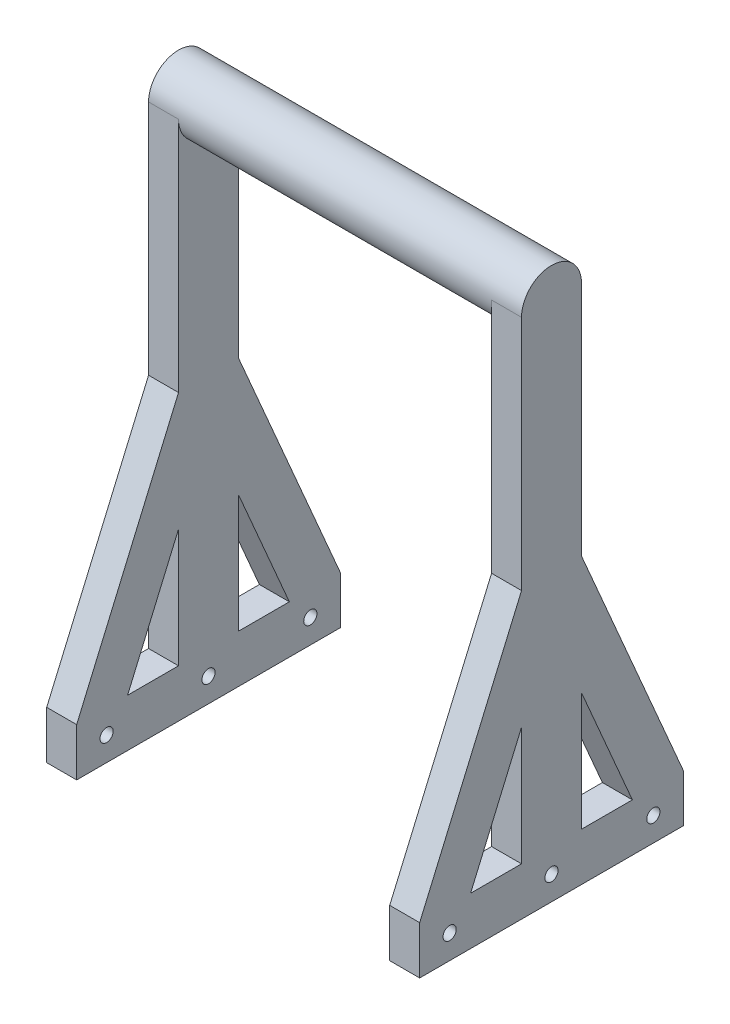
ISO-10303-21;
HEADER;
FILE_DESCRIPTION(('STEP AP214'),'2;1');
FILE_NAME('part.step','',(''),(''),'','','');
FILE_SCHEMA(('AUTOMOTIVE_DESIGN { 1 0 10303 214 1 1 1 1 }'));
ENDSEC;
DATA;
#1=APPLICATION_CONTEXT('core data for automotive mechanical design processes');
#2=APPLICATION_PROTOCOL_DEFINITION('international standard','automotive_design',2000,#1);
#3=PRODUCT_CONTEXT('',#1,'mechanical');
#4=PRODUCT('Part','Part','',(#3));
#5=PRODUCT_RELATED_PRODUCT_CATEGORY('part','',(#4));
#6=PRODUCT_DEFINITION_FORMATION('','',#4);
#7=PRODUCT_DEFINITION_CONTEXT('part definition',#1,'design');
#8=PRODUCT_DEFINITION('design','',#6,#7);
#9=PRODUCT_DEFINITION_SHAPE('','',#8);
#10=(LENGTH_UNIT() NAMED_UNIT(*) SI_UNIT(.MILLI.,.METRE.));
#11=(NAMED_UNIT(*) PLANE_ANGLE_UNIT() SI_UNIT($,.RADIAN.));
#12=(NAMED_UNIT(*) SI_UNIT($,.STERADIAN.) SOLID_ANGLE_UNIT());
#13=UNCERTAINTY_MEASURE_WITH_UNIT(LENGTH_MEASURE(1.E-05),#10,'distance_accuracy_value','');
#14=(GEOMETRIC_REPRESENTATION_CONTEXT(3) GLOBAL_UNCERTAINTY_ASSIGNED_CONTEXT((#13)) GLOBAL_UNIT_ASSIGNED_CONTEXT((#10,
#11,#12)) REPRESENTATION_CONTEXT('',''));
#15=CARTESIAN_POINT('',(0.,0.,0.));
#16=DIRECTION('',(0.,0.,1.));
#17=DIRECTION('',(1.,0.,0.));
#18=AXIS2_PLACEMENT_3D('',#15,#16,#17);
#19=CARTESIAN_POINT('',(62.25,174.,-10.));
#20=DIRECTION('',(0.,0.,1.));
#21=DIRECTION('',(1.,0.,0.));
#22=AXIS2_PLACEMENT_3D('',#19,#20,#21);
#23=PLANE('',#22);
#24=DIRECTION('',(0.,-1.,0.));
#25=VECTOR('',#24,1.);
#26=CARTESIAN_POINT('',(52.25,174.,-10.));
#27=LINE('',#26,#25);
#28=CARTESIAN_POINT('',(52.25,55.4999999999999,-10.));
#29=VERTEX_POINT('',#28);
#30=CARTESIAN_POINT('',(52.25,16.,-10.));
#31=VERTEX_POINT('',#30);
#32=EDGE_CURVE('E251',#29,#31,#27,.T.);
#33=ORIENTED_EDGE('',*,*,#32,.F.);
#34=DIRECTION('',(1.,0.,0.));
#35=VECTOR('',#34,1.);
#36=CARTESIAN_POINT('',(52.25,55.4999999999999,-10.0000000000001));
#37=LINE('',#36,#35);
#38=CARTESIAN_POINT('',(62.25,55.4999999999999,-10.0000000000001));
#39=VERTEX_POINT('',#38);
#40=EDGE_CURVE('E406',#29,#39,#37,.T.);
#41=ORIENTED_EDGE('',*,*,#40,.T.);
#42=DIRECTION('',(0.,-1.,0.));
#43=VECTOR('',#42,1.);
#44=CARTESIAN_POINT('',(62.25,174.,-10.));
#45=LINE('',#44,#43);
#46=CARTESIAN_POINT('',(62.25,16.,-10.));
#47=VERTEX_POINT('',#46);
#48=EDGE_CURVE('E396',#39,#47,#45,.T.);
#49=ORIENTED_EDGE('',*,*,#48,.T.);
#50=DIRECTION('',(-1.,0.,0.));
#51=VECTOR('',#50,1.);
#52=CARTESIAN_POINT('',(62.25,16.,-10.));
#53=LINE('',#52,#51);
#54=EDGE_CURVE('E261',#47,#31,#53,.T.);
#55=ORIENTED_EDGE('',*,*,#54,.T.);
#56=EDGE_LOOP('',(#33,#41,#49,#55));
#57=FACE_BOUND('',#56,.T.);
#58=ADVANCED_FACE('F39',(#57),#23,.F.);
#59=CARTESIAN_POINT('',(62.25,174.,9.99999999999999));
#60=DIRECTION('',(0.,0.,-1.));
#61=DIRECTION('',(-1.,0.,0.));
#62=AXIS2_PLACEMENT_3D('',#59,#60,#61);
#63=PLANE('',#62);
#64=DIRECTION('',(0.,-1.,0.));
#65=VECTOR('',#64,1.);
#66=CARTESIAN_POINT('',(52.25,174.,9.99999999999999));
#67=LINE('',#66,#65);
#68=CARTESIAN_POINT('',(52.25,174.,9.99999999999999));
#69=VERTEX_POINT('',#68);
#70=CARTESIAN_POINT('',(52.25,95.,9.99999999999999));
#71=VERTEX_POINT('',#70);
#72=EDGE_CURVE('E246',#69,#71,#67,.T.);
#73=ORIENTED_EDGE('',*,*,#72,.T.);
#74=DIRECTION('',(1.,0.,0.));
#75=VECTOR('',#74,1.);
#76=CARTESIAN_POINT('',(52.25,95.,9.99999999999999));
#77=LINE('',#76,#75);
#78=CARTESIAN_POINT('',(62.25,95.,9.99999999999999));
#79=VERTEX_POINT('',#78);
#80=EDGE_CURVE('E242',#71,#79,#77,.T.);
#81=ORIENTED_EDGE('',*,*,#80,.T.);
#82=DIRECTION('',(0.,-1.,0.));
#83=VECTOR('',#82,1.);
#84=CARTESIAN_POINT('',(62.25,174.,9.99999999999999));
#85=LINE('',#84,#83);
#86=CARTESIAN_POINT('',(62.25,174.,9.99999999999999));
#87=VERTEX_POINT('',#86);
#88=EDGE_CURVE('E255',#87,#79,#85,.T.);
#89=ORIENTED_EDGE('',*,*,#88,.F.);
#90=DIRECTION('',(1.,0.,0.));
#91=VECTOR('',#90,1.);
#92=CARTESIAN_POINT('',(62.25,174.,9.99999999999999));
#93=LINE('',#92,#91);
#94=EDGE_CURVE('E258',#69,#87,#93,.T.);
#95=ORIENTED_EDGE('',*,*,#94,.F.);
#96=EDGE_LOOP('',(#73,#81,#89,#95));
#97=FACE_BOUND('',#96,.T.);
#98=ADVANCED_FACE('F509',(#97),#63,.F.);
#99=CARTESIAN_POINT('',(-62.25,174.,10.));
#100=DIRECTION('',(0.,0.,-1.));
#101=DIRECTION('',(-1.,0.,0.));
#102=AXIS2_PLACEMENT_3D('',#99,#100,#101);
#103=PLANE('',#102);
#104=DIRECTION('',(0.,-1.,0.));
#105=VECTOR('',#104,1.);
#106=CARTESIAN_POINT('',(-52.25,174.,10.));
#107=LINE('',#106,#105);
#108=CARTESIAN_POINT('',(-52.25,55.5,10.));
#109=VERTEX_POINT('',#108);
#110=CARTESIAN_POINT('',(-52.25,16.,10.));
#111=VERTEX_POINT('',#110);
#112=EDGE_CURVE('E329',#109,#111,#107,.T.);
#113=ORIENTED_EDGE('',*,*,#112,.F.);
#114=DIRECTION('',(-1.,0.,0.));
#115=VECTOR('',#114,1.);
#116=CARTESIAN_POINT('',(-52.25,55.5,9.99999999999997));
#117=LINE('',#116,#115);
#118=CARTESIAN_POINT('',(-62.25,55.5,9.99999999999997));
#119=VERTEX_POINT('',#118);
#120=EDGE_CURVE('E459',#109,#119,#117,.T.);
#121=ORIENTED_EDGE('',*,*,#120,.T.);
#122=DIRECTION('',(0.,-1.,0.));
#123=VECTOR('',#122,1.);
#124=CARTESIAN_POINT('',(-62.25,174.,10.));
#125=LINE('',#124,#123);
#126=CARTESIAN_POINT('',(-62.25,16.,10.));
#127=VERTEX_POINT('',#126);
#128=EDGE_CURVE('E333',#119,#127,#125,.T.);
#129=ORIENTED_EDGE('',*,*,#128,.T.);
#130=DIRECTION('',(1.,0.,0.));
#131=VECTOR('',#130,1.);
#132=CARTESIAN_POINT('',(-62.25,16.,10.));
#133=LINE('',#132,#131);
#134=EDGE_CURVE('E309',#127,#111,#133,.T.);
#135=ORIENTED_EDGE('',*,*,#134,.T.);
#136=EDGE_LOOP('',(#113,#121,#129,#135));
#137=FACE_BOUND('',#136,.T.);
#138=ADVANCED_FACE('F506',(#137),#103,.F.);
#139=CARTESIAN_POINT('',(-62.25,174.,-10.));
#140=DIRECTION('',(0.,0.,1.));
#141=DIRECTION('',(1.,0.,0.));
#142=AXIS2_PLACEMENT_3D('',#139,#140,#141);
#143=PLANE('',#142);
#144=DIRECTION('',(0.,-1.,0.));
#145=VECTOR('',#144,1.);
#146=CARTESIAN_POINT('',(-52.25,174.,-10.));
#147=LINE('',#146,#145);
#148=CARTESIAN_POINT('',(-52.25,174.,-10.));
#149=VERTEX_POINT('',#148);
#150=CARTESIAN_POINT('',(-52.25,95.,-9.99999999999999));
#151=VERTEX_POINT('',#150);
#152=EDGE_CURVE('E326',#149,#151,#147,.T.);
#153=ORIENTED_EDGE('',*,*,#152,.T.);
#154=DIRECTION('',(-1.,0.,0.));
#155=VECTOR('',#154,1.);
#156=CARTESIAN_POINT('',(-52.25,95.,-9.99999999999999));
#157=LINE('',#156,#155);
#158=CARTESIAN_POINT('',(-62.25,95.,-10.));
#159=VERTEX_POINT('',#158);
#160=EDGE_CURVE('E446',#151,#159,#157,.T.);
#161=ORIENTED_EDGE('',*,*,#160,.T.);
#162=DIRECTION('',(0.,-1.,0.));
#163=VECTOR('',#162,1.);
#164=CARTESIAN_POINT('',(-62.25,174.,-10.));
#165=LINE('',#164,#163);
#166=CARTESIAN_POINT('',(-62.25,174.,-10.));
#167=VERTEX_POINT('',#166);
#168=EDGE_CURVE('E322',#167,#159,#165,.T.);
#169=ORIENTED_EDGE('',*,*,#168,.F.);
#170=DIRECTION('',(-1.,0.,0.));
#171=VECTOR('',#170,1.);
#172=CARTESIAN_POINT('',(-62.25,174.,-10.));
#173=LINE('',#172,#171);
#174=EDGE_CURVE('E313',#149,#167,#173,.T.);
#175=ORIENTED_EDGE('',*,*,#174,.F.);
#176=EDGE_LOOP('',(#153,#161,#169,#175));
#177=FACE_BOUND('',#176,.T.);
#178=ADVANCED_FACE('F508',(#177),#143,.F.);
#179=CARTESIAN_POINT('',(62.25,174.,0.));
#180=DIRECTION('',(-1.,0.,0.));
#181=DIRECTION('',(0.,0.,1.));
#182=AXIS2_PLACEMENT_3D('',#179,#180,#181);
#183=CYLINDRICAL_SURFACE('',#182,10.);
#184=CARTESIAN_POINT('',(-52.25,174.,0.));
#185=DIRECTION('',(-1.,0.,0.));
#186=DIRECTION('',(0.,0.,1.));
#187=AXIS2_PLACEMENT_3D('',#184,#185,#186);
#188=CIRCLE('',#187,10.);
#189=CARTESIAN_POINT('',(-52.25,174.,10.));
#190=VERTEX_POINT('',#189);
#191=EDGE_CURVE('E305',#149,#190,#188,.T.);
#192=ORIENTED_EDGE('',*,*,#191,.F.);
#193=ORIENTED_EDGE('',*,*,#174,.T.);
#194=CARTESIAN_POINT('',(-62.25,174.,0.));
#195=DIRECTION('',(-1.,0.,0.));
#196=DIRECTION('',(0.,0.,1.));
#197=AXIS2_PLACEMENT_3D('',#194,#195,#196);
#198=CIRCLE('',#197,10.);
#199=CARTESIAN_POINT('',(-62.25,174.,10.));
#200=VERTEX_POINT('',#199);
#201=EDGE_CURVE('E292',#200,#167,#198,.T.);
#202=ORIENTED_EDGE('',*,*,#201,.F.);
#203=DIRECTION('',(1.,0.,0.));
#204=VECTOR('',#203,1.);
#205=CARTESIAN_POINT('',(-62.25,174.,10.));
#206=LINE('',#205,#204);
#207=EDGE_CURVE('E310',#200,#190,#206,.T.);
#208=ORIENTED_EDGE('',*,*,#207,.T.);
#209=EDGE_LOOP('',(#192,#193,#202,#208));
#210=FACE_BOUND('',#209,.T.);
#211=CARTESIAN_POINT('',(52.25,174.,0.));
#212=DIRECTION('',(1.,0.,0.));
#213=DIRECTION('',(0.,0.,-1.));
#214=AXIS2_PLACEMENT_3D('',#211,#212,#213);
#215=CIRCLE('',#214,10.);
#216=CARTESIAN_POINT('',(52.25,174.,-10.));
#217=VERTEX_POINT('',#216);
#218=EDGE_CURVE('E11',#217,#69,#215,.F.);
#219=ORIENTED_EDGE('',*,*,#218,.T.);
#220=ORIENTED_EDGE('',*,*,#94,.T.);
#221=CARTESIAN_POINT('',(62.25,174.,0.));
#222=DIRECTION('',(-1.,0.,0.));
#223=DIRECTION('',(0.,0.,1.));
#224=AXIS2_PLACEMENT_3D('',#221,#222,#223);
#225=CIRCLE('',#224,10.);
#226=CARTESIAN_POINT('',(62.25,174.,-10.));
#227=VERTEX_POINT('',#226);
#228=EDGE_CURVE('E302',#87,#227,#225,.T.);
#229=ORIENTED_EDGE('',*,*,#228,.T.);
#230=DIRECTION('',(-1.,0.,0.));
#231=VECTOR('',#230,1.);
#232=CARTESIAN_POINT('',(62.25,174.,-10.));
#233=LINE('',#232,#231);
#234=EDGE_CURVE('E262',#227,#217,#233,.T.);
#235=ORIENTED_EDGE('',*,*,#234,.T.);
#236=EDGE_LOOP('',(#219,#220,#229,#235));
#237=FACE_BOUND('',#236,.T.);
#238=ADVANCED_FACE('F516',(#210,#237),#183,.T.);
#239=CARTESIAN_POINT('',(0.,16.,0.));
#240=DIRECTION('',(0.,1.,0.));
#241=DIRECTION('',(0.,0.,1.));
#242=AXIS2_PLACEMENT_3D('',#239,#240,#241);
#243=PLANE('',#242);
#244=DIRECTION('',(-1.,0.,0.));
#245=VECTOR('',#244,1.);
#246=CARTESIAN_POINT('',(-52.25,16.,-27.));
#247=LINE('',#246,#245);
#248=CARTESIAN_POINT('',(-52.25,16.,-27.));
#249=VERTEX_POINT('',#248);
#250=CARTESIAN_POINT('',(-62.25,16.,-27.));
#251=VERTEX_POINT('',#250);
#252=EDGE_CURVE('E440',#249,#251,#247,.T.);
#253=ORIENTED_EDGE('',*,*,#252,.T.);
#254=DIRECTION('',(0.,0.,1.));
#255=VECTOR('',#254,1.);
#256=CARTESIAN_POINT('',(-62.25,16.,-44.));
#257=LINE('',#256,#255);
#258=CARTESIAN_POINT('',(-62.25,16.,-10.));
#259=VERTEX_POINT('',#258);
#260=EDGE_CURVE('E344',#251,#259,#257,.T.);
#261=ORIENTED_EDGE('',*,*,#260,.T.);
#262=DIRECTION('',(-1.,0.,0.));
#263=VECTOR('',#262,1.);
#264=CARTESIAN_POINT('',(-62.25,16.,-10.));
#265=LINE('',#264,#263);
#266=CARTESIAN_POINT('',(-52.25,16.,-10.));
#267=VERTEX_POINT('',#266);
#268=EDGE_CURVE('E314',#267,#259,#265,.T.);
#269=ORIENTED_EDGE('',*,*,#268,.F.);
#270=DIRECTION('',(0.,0.,-1.));
#271=VECTOR('',#270,1.);
#272=CARTESIAN_POINT('',(-52.25,16.,-44.));
#273=LINE('',#272,#271);
#274=EDGE_CURVE('E340',#267,#249,#273,.T.);
#275=ORIENTED_EDGE('',*,*,#274,.T.);
#276=EDGE_LOOP('',(#253,#261,#269,#275));
#277=FACE_BOUND('',#276,.T.);
#278=ADVANCED_FACE('F558',(#277),#243,.T.);
#279=CARTESIAN_POINT('',(-52.25,16.,-44.));
#280=DIRECTION('',(-1.,0.,0.));
#281=DIRECTION('',(0.,0.,1.));
#282=AXIS2_PLACEMENT_3D('',#279,#280,#281);
#283=PLANE('',#282);
#284=DIRECTION('',(0.,0.918542556009364,0.395322112712891));
#285=VECTOR('',#284,1.);
#286=CARTESIAN_POINT('',(-52.25,16.,-27.));
#287=LINE('',#286,#285);
#288=CARTESIAN_POINT('',(-52.25,55.5,-9.99999999999998));
#289=VERTEX_POINT('',#288);
#290=EDGE_CURVE('E434',#249,#289,#287,.T.);
#291=ORIENTED_EDGE('',*,*,#290,.F.);
#292=ORIENTED_EDGE('',*,*,#274,.F.);
#293=EDGE_CURVE('E325',#289,#267,#147,.T.);
#294=ORIENTED_EDGE('',*,*,#293,.F.);
#295=EDGE_LOOP('',(#291,#292,#294));
#296=FACE_BOUND('',#295,.T.);
#297=CARTESIAN_POINT('',(-52.25,16.,27.));
#298=VERTEX_POINT('',#297);
#299=EDGE_CURVE('E337',#298,#111,#273,.T.);
#300=ORIENTED_EDGE('',*,*,#299,.F.);
#301=DIRECTION('',(0.,-0.918542556009364,0.395322112712891));
#302=VECTOR('',#301,1.);
#303=CARTESIAN_POINT('',(-52.25,16.,27.));
#304=LINE('',#303,#302);
#305=EDGE_CURVE('E458',#109,#298,#304,.T.);
#306=ORIENTED_EDGE('',*,*,#305,.F.);
#307=ORIENTED_EDGE('',*,*,#112,.T.);
#308=EDGE_LOOP('',(#300,#306,#307));
#309=FACE_BOUND('',#308,.T.);
#310=CARTESIAN_POINT('',(-52.25,8.00000000000001,34.));
#311=DIRECTION('',(-1.,0.,0.));
#312=DIRECTION('',(0.,0.,1.));
#313=AXIS2_PLACEMENT_3D('',#310,#311,#312);
#314=CIRCLE('',#313,2.2);
#315=CARTESIAN_POINT('',(-52.25,8.00000000000001,36.2));
#316=VERTEX_POINT('',#315);
#317=EDGE_CURVE('E394',#316,#316,#314,.T.);
#318=ORIENTED_EDGE('',*,*,#317,.T.);
#319=EDGE_LOOP('',(#318));
#320=FACE_BOUND('',#319,.T.);
#321=CARTESIAN_POINT('',(-52.25,8.00000000000001,-34.));
#322=DIRECTION('',(-1.,0.,0.));
#323=DIRECTION('',(0.,0.,1.));
#324=AXIS2_PLACEMENT_3D('',#321,#322,#323);
#325=CIRCLE('',#324,2.2);
#326=CARTESIAN_POINT('',(-52.25,8.00000000000001,-31.8));
#327=VERTEX_POINT('',#326);
#328=EDGE_CURVE('E379',#327,#327,#325,.T.);
#329=ORIENTED_EDGE('',*,*,#328,.T.);
#330=EDGE_LOOP('',(#329));
#331=FACE_BOUND('',#330,.T.);
#332=CARTESIAN_POINT('',(-52.25,8.,0.));
#333=DIRECTION('',(-1.,0.,0.));
#334=DIRECTION('',(0.,0.,1.));
#335=AXIS2_PLACEMENT_3D('',#332,#333,#334);
#336=CIRCLE('',#335,2.2);
#337=CARTESIAN_POINT('',(-52.25,8.,2.2));
#338=VERTEX_POINT('',#337);
#339=EDGE_CURVE('E375',#338,#338,#336,.T.);
#340=ORIENTED_EDGE('',*,*,#339,.T.);
#341=EDGE_LOOP('',(#340));
#342=FACE_BOUND('',#341,.T.);
#343=ORIENTED_EDGE('',*,*,#152,.F.);
#344=ORIENTED_EDGE('',*,*,#191,.T.);
#345=CARTESIAN_POINT('',(-52.25,95.,10.));
#346=VERTEX_POINT('',#345);
#347=EDGE_CURVE('E330',#190,#346,#107,.T.);
#348=ORIENTED_EDGE('',*,*,#347,.T.);
#349=DIRECTION('',(0.,0.918542556009365,-0.395322112712891));
#350=VECTOR('',#349,1.);
#351=CARTESIAN_POINT('',(-52.25,16.,44.));
#352=LINE('',#351,#350);
#353=CARTESIAN_POINT('',(-52.25,16.,44.));
#354=VERTEX_POINT('',#353);
#355=EDGE_CURVE('E468',#354,#346,#352,.T.);
#356=ORIENTED_EDGE('',*,*,#355,.F.);
#357=DIRECTION('',(0.,-1.,0.));
#358=VECTOR('',#357,1.);
#359=CARTESIAN_POINT('',(-52.25,16.,44.));
#360=LINE('',#359,#358);
#361=CARTESIAN_POINT('',(-52.25,0.,44.));
#362=VERTEX_POINT('',#361);
#363=EDGE_CURVE('E349',#354,#362,#360,.T.);
#364=ORIENTED_EDGE('',*,*,#363,.T.);
#365=DIRECTION('',(0.,0.,-1.));
#366=VECTOR('',#365,1.);
#367=CARTESIAN_POINT('',(-52.25,0.,-44.));
#368=LINE('',#367,#366);
#369=CARTESIAN_POINT('',(-52.25,0.,-44.));
#370=VERTEX_POINT('',#369);
#371=EDGE_CURVE('E336',#362,#370,#368,.T.);
#372=ORIENTED_EDGE('',*,*,#371,.T.);
#373=DIRECTION('',(0.,-1.,0.));
#374=VECTOR('',#373,1.);
#375=CARTESIAN_POINT('',(-52.25,16.,-44.));
#376=LINE('',#375,#374);
#377=CARTESIAN_POINT('',(-52.25,16.,-44.));
#378=VERTEX_POINT('',#377);
#379=EDGE_CURVE('E48',#378,#370,#376,.T.);
#380=ORIENTED_EDGE('',*,*,#379,.F.);
#381=DIRECTION('',(0.,-0.918542556009364,-0.395322112712891));
#382=VECTOR('',#381,1.);
#383=CARTESIAN_POINT('',(-52.25,16.,-44.));
#384=LINE('',#383,#382);
#385=EDGE_CURVE('E436',#151,#378,#384,.T.);
#386=ORIENTED_EDGE('',*,*,#385,.F.);
#387=EDGE_LOOP('',(#343,#344,#348,#356,#364,#372,#380,#386));
#388=FACE_BOUND('',#387,.T.);
#389=ADVANCED_FACE('F41',(#296,#309,#320,#331,#342,#388),#283,.F.);
#390=CARTESIAN_POINT('',(-62.25,16.,-44.));
#391=DIRECTION('',(0.,0.,1.));
#392=DIRECTION('',(1.,0.,0.));
#393=AXIS2_PLACEMENT_3D('',#390,#391,#392);
#394=PLANE('',#393);
#395=DIRECTION('',(-1.,0.,0.));
#396=VECTOR('',#395,1.);
#397=CARTESIAN_POINT('',(-62.25,0.,-44.));
#398=LINE('',#397,#396);
#399=CARTESIAN_POINT('',(-62.25,0.,-44.));
#400=VERTEX_POINT('',#399);
#401=EDGE_CURVE('E352',#370,#400,#398,.T.);
#402=ORIENTED_EDGE('',*,*,#401,.T.);
#403=DIRECTION('',(0.,-1.,0.));
#404=VECTOR('',#403,1.);
#405=CARTESIAN_POINT('',(-62.25,16.,-44.));
#406=LINE('',#405,#404);
#407=CARTESIAN_POINT('',(-62.25,16.,-44.));
#408=VERTEX_POINT('',#407);
#409=EDGE_CURVE('E363',#408,#400,#406,.T.);
#410=ORIENTED_EDGE('',*,*,#409,.F.);
#411=DIRECTION('',(-1.,0.,0.));
#412=VECTOR('',#411,1.);
#413=CARTESIAN_POINT('',(-62.25,16.,-44.));
#414=LINE('',#413,#412);
#415=EDGE_CURVE('E339',#378,#408,#414,.T.);
#416=ORIENTED_EDGE('',*,*,#415,.F.);
#417=ORIENTED_EDGE('',*,*,#379,.T.);
#418=EDGE_LOOP('',(#402,#410,#416,#417));
#419=FACE_BOUND('',#418,.T.);
#420=ADVANCED_FACE('F489',(#419),#394,.F.);
#421=CARTESIAN_POINT('',(-62.25,16.,-44.));
#422=DIRECTION('',(1.,0.,0.));
#423=DIRECTION('',(0.,0.,-1.));
#424=AXIS2_PLACEMENT_3D('',#421,#422,#423);
#425=PLANE('',#424);
#426=ORIENTED_EDGE('',*,*,#260,.F.);
#427=DIRECTION('',(0.,0.918542556009364,0.395322112712891));
#428=VECTOR('',#427,1.);
#429=CARTESIAN_POINT('',(-62.25,16.,-27.));
#430=LINE('',#429,#428);
#431=CARTESIAN_POINT('',(-62.25,55.5,-10.));
#432=VERTEX_POINT('',#431);
#433=EDGE_CURVE('E441',#251,#432,#430,.T.);
#434=ORIENTED_EDGE('',*,*,#433,.T.);
#435=EDGE_CURVE('E317',#432,#259,#165,.T.);
#436=ORIENTED_EDGE('',*,*,#435,.T.);
#437=EDGE_LOOP('',(#426,#434,#436));
#438=FACE_BOUND('',#437,.T.);
#439=DIRECTION('',(0.,-1.,0.));
#440=VECTOR('',#439,1.);
#441=CARTESIAN_POINT('',(-62.25,16.,44.));
#442=LINE('',#441,#440);
#443=CARTESIAN_POINT('',(-62.25,16.,44.));
#444=VERTEX_POINT('',#443);
#445=CARTESIAN_POINT('',(-62.25,0.,44.));
#446=VERTEX_POINT('',#445);
#447=EDGE_CURVE('E360',#444,#446,#442,.T.);
#448=ORIENTED_EDGE('',*,*,#447,.F.);
#449=DIRECTION('',(0.,0.918542556009365,-0.395322112712891));
#450=VECTOR('',#449,1.);
#451=CARTESIAN_POINT('',(-62.25,16.,44.));
#452=LINE('',#451,#450);
#453=CARTESIAN_POINT('',(-62.25,95.,10.));
#454=VERTEX_POINT('',#453);
#455=EDGE_CURVE('E443',#444,#454,#452,.T.);
#456=ORIENTED_EDGE('',*,*,#455,.T.);
#457=EDGE_CURVE('E334',#200,#454,#125,.T.);
#458=ORIENTED_EDGE('',*,*,#457,.F.);
#459=ORIENTED_EDGE('',*,*,#201,.T.);
#460=ORIENTED_EDGE('',*,*,#168,.T.);
#461=DIRECTION('',(0.,-0.918542556009364,-0.395322112712891));
#462=VECTOR('',#461,1.);
#463=CARTESIAN_POINT('',(-62.25,16.,-44.));
#464=LINE('',#463,#462);
#465=EDGE_CURVE('E437',#159,#408,#464,.T.);
#466=ORIENTED_EDGE('',*,*,#465,.T.);
#467=ORIENTED_EDGE('',*,*,#409,.T.);
#468=DIRECTION('',(0.,0.,1.));
#469=VECTOR('',#468,1.);
#470=CARTESIAN_POINT('',(-62.25,0.,-44.));
#471=LINE('',#470,#469);
#472=EDGE_CURVE('E354',#400,#446,#471,.T.);
#473=ORIENTED_EDGE('',*,*,#472,.T.);
#474=EDGE_LOOP('',(#448,#456,#458,#459,#460,#466,#467,#473));
#475=FACE_BOUND('',#474,.T.);
#476=CARTESIAN_POINT('',(-62.25,8.00000000000001,34.));
#477=DIRECTION('',(-1.,0.,0.));
#478=DIRECTION('',(0.,0.,1.));
#479=AXIS2_PLACEMENT_3D('',#476,#477,#478);
#480=CIRCLE('',#479,2.2);
#481=CARTESIAN_POINT('',(-62.25,8.00000000000001,36.2));
#482=VERTEX_POINT('',#481);
#483=EDGE_CURVE('E449',#482,#482,#480,.T.);
#484=ORIENTED_EDGE('',*,*,#483,.F.);
#485=EDGE_LOOP('',(#484));
#486=FACE_BOUND('',#485,.T.);
#487=CARTESIAN_POINT('',(-62.25,8.00000000000001,-34.));
#488=DIRECTION('',(-1.,0.,0.));
#489=DIRECTION('',(0.,0.,1.));
#490=AXIS2_PLACEMENT_3D('',#487,#488,#489);
#491=CIRCLE('',#490,2.2);
#492=CARTESIAN_POINT('',(-62.25,8.00000000000001,-31.8));
#493=VERTEX_POINT('',#492);
#494=EDGE_CURVE('E475',#493,#493,#491,.T.);
#495=ORIENTED_EDGE('',*,*,#494,.F.);
#496=EDGE_LOOP('',(#495));
#497=FACE_BOUND('',#496,.T.);
#498=CARTESIAN_POINT('',(-62.25,8.,0.));
#499=DIRECTION('',(-1.,0.,0.));
#500=DIRECTION('',(0.,0.,1.));
#501=AXIS2_PLACEMENT_3D('',#498,#499,#500);
#502=CIRCLE('',#501,2.2);
#503=CARTESIAN_POINT('',(-62.25,8.,2.2));
#504=VERTEX_POINT('',#503);
#505=EDGE_CURVE('E371',#504,#504,#502,.T.);
#506=ORIENTED_EDGE('',*,*,#505,.F.);
#507=EDGE_LOOP('',(#506));
#508=FACE_BOUND('',#507,.T.);
#509=DIRECTION('',(0.,-0.918542556009364,0.395322112712891));
#510=VECTOR('',#509,1.);
#511=CARTESIAN_POINT('',(-62.25,16.,27.));
#512=LINE('',#511,#510);
#513=CARTESIAN_POINT('',(-62.25,16.,27.));
#514=VERTEX_POINT('',#513);
#515=EDGE_CURVE('E465',#119,#514,#512,.T.);
#516=ORIENTED_EDGE('',*,*,#515,.T.);
#517=EDGE_CURVE('E343',#127,#514,#257,.T.);
#518=ORIENTED_EDGE('',*,*,#517,.F.);
#519=ORIENTED_EDGE('',*,*,#128,.F.);
#520=EDGE_LOOP('',(#516,#518,#519));
#521=FACE_BOUND('',#520,.T.);
#522=ADVANCED_FACE('F485',(#438,#475,#486,#497,#508,#521),#425,.F.);
#523=CARTESIAN_POINT('',(-62.25,16.,44.));
#524=DIRECTION('',(0.,0.,-1.));
#525=DIRECTION('',(-1.,0.,0.));
#526=AXIS2_PLACEMENT_3D('',#523,#524,#525);
#527=PLANE('',#526);
#528=DIRECTION('',(1.,0.,0.));
#529=VECTOR('',#528,1.);
#530=CARTESIAN_POINT('',(-62.25,0.,44.));
#531=LINE('',#530,#529);
#532=EDGE_CURVE('E356',#446,#362,#531,.T.);
#533=ORIENTED_EDGE('',*,*,#532,.T.);
#534=ORIENTED_EDGE('',*,*,#363,.F.);
#535=DIRECTION('',(1.,0.,0.));
#536=VECTOR('',#535,1.);
#537=CARTESIAN_POINT('',(-62.25,16.,44.));
#538=LINE('',#537,#536);
#539=EDGE_CURVE('E346',#444,#354,#538,.T.);
#540=ORIENTED_EDGE('',*,*,#539,.F.);
#541=ORIENTED_EDGE('',*,*,#447,.T.);
#542=EDGE_LOOP('',(#533,#534,#540,#541));
#543=FACE_BOUND('',#542,.T.);
#544=ADVANCED_FACE('F488',(#543),#527,.F.);
#545=DIRECTION('',(-1.,0.,0.));
#546=VECTOR('',#545,1.);
#547=CARTESIAN_POINT('',(-52.25,16.,27.));
#548=LINE('',#547,#546);
#549=EDGE_CURVE('E462',#298,#514,#548,.T.);
#550=ORIENTED_EDGE('',*,*,#549,.F.);
#551=ORIENTED_EDGE('',*,*,#299,.T.);
#552=ORIENTED_EDGE('',*,*,#134,.F.);
#553=ORIENTED_EDGE('',*,*,#517,.T.);
#554=EDGE_LOOP('',(#550,#551,#552,#553));
#555=FACE_BOUND('',#554,.T.);
#556=ADVANCED_FACE('F500',(#555),#243,.T.);
#557=CARTESIAN_POINT('',(0.,0.,0.));
#558=DIRECTION('',(0.,1.,0.));
#559=DIRECTION('',(0.,0.,1.));
#560=AXIS2_PLACEMENT_3D('',#557,#558,#559);
#561=PLANE('',#560);
#562=ORIENTED_EDGE('',*,*,#371,.F.);
#563=ORIENTED_EDGE('',*,*,#532,.F.);
#564=ORIENTED_EDGE('',*,*,#472,.F.);
#565=ORIENTED_EDGE('',*,*,#401,.F.);
#566=EDGE_LOOP('',(#562,#563,#564,#565));
#567=FACE_BOUND('',#566,.T.);
#568=ADVANCED_FACE('F525',(#567),#561,.F.);
#569=ORIENTED_EDGE('',*,*,#457,.T.);
#570=DIRECTION('',(-1.,0.,0.));
#571=VECTOR('',#570,1.);
#572=CARTESIAN_POINT('',(-52.25,95.,9.99999999999999));
#573=LINE('',#572,#571);
#574=EDGE_CURVE('E455',#346,#454,#573,.T.);
#575=ORIENTED_EDGE('',*,*,#574,.F.);
#576=ORIENTED_EDGE('',*,*,#347,.F.);
#577=ORIENTED_EDGE('',*,*,#207,.F.);
#578=EDGE_LOOP('',(#569,#575,#576,#577));
#579=FACE_BOUND('',#578,.T.);
#580=ADVANCED_FACE('F511',(#579),#103,.F.);
#581=ORIENTED_EDGE('',*,*,#435,.F.);
#582=DIRECTION('',(-1.,0.,0.));
#583=VECTOR('',#582,1.);
#584=CARTESIAN_POINT('',(-52.25,55.5,-9.99999999999998));
#585=LINE('',#584,#583);
#586=EDGE_CURVE('E450',#289,#432,#585,.T.);
#587=ORIENTED_EDGE('',*,*,#586,.F.);
#588=ORIENTED_EDGE('',*,*,#293,.T.);
#589=ORIENTED_EDGE('',*,*,#268,.T.);
#590=EDGE_LOOP('',(#581,#587,#588,#589));
#591=FACE_BOUND('',#590,.T.);
#592=ADVANCED_FACE('F519',(#591),#143,.F.);
#593=CARTESIAN_POINT('',(62.25,174.,0.));
#594=DIRECTION('',(-1.,0.,0.));
#595=DIRECTION('',(0.,0.,1.));
#596=AXIS2_PLACEMENT_3D('',#593,#594,#595);
#597=PLANE('',#596);
#598=DIRECTION('',(0.,0.,-1.));
#599=VECTOR('',#598,1.);
#600=CARTESIAN_POINT('',(62.25,16.,-44.));
#601=LINE('',#600,#599);
#602=CARTESIAN_POINT('',(62.25,16.,27.));
#603=VERTEX_POINT('',#602);
#604=CARTESIAN_POINT('',(62.25,16.,9.99999999999999));
#605=VERTEX_POINT('',#604);
#606=EDGE_CURVE('E285',#603,#605,#601,.T.);
#607=ORIENTED_EDGE('',*,*,#606,.F.);
#608=DIRECTION('',(0.,0.918542556009364,-0.395322112712892));
#609=VECTOR('',#608,1.);
#610=CARTESIAN_POINT('',(62.25,16.,27.));
#611=LINE('',#610,#609);
#612=CARTESIAN_POINT('',(62.25,55.4999999999999,9.99999999999999));
#613=VERTEX_POINT('',#612);
#614=EDGE_CURVE('E422',#603,#613,#611,.T.);
#615=ORIENTED_EDGE('',*,*,#614,.T.);
#616=EDGE_CURVE('E241',#613,#605,#85,.T.);
#617=ORIENTED_EDGE('',*,*,#616,.T.);
#618=EDGE_LOOP('',(#607,#615,#617));
#619=FACE_BOUND('',#618,.T.);
#620=DIRECTION('',(0.,-1.,0.));
#621=VECTOR('',#620,1.);
#622=CARTESIAN_POINT('',(62.25,16.,-44.));
#623=LINE('',#622,#621);
#624=CARTESIAN_POINT('',(62.25,16.,-44.));
#625=VERTEX_POINT('',#624);
#626=CARTESIAN_POINT('',(62.25,0.,-44.));
#627=VERTEX_POINT('',#626);
#628=EDGE_CURVE('E265',#625,#627,#623,.T.);
#629=ORIENTED_EDGE('',*,*,#628,.F.);
#630=DIRECTION('',(0.,0.918542556009365,0.395322112712891));
#631=VECTOR('',#630,1.);
#632=CARTESIAN_POINT('',(62.25,16.,-44.));
#633=LINE('',#632,#631);
#634=CARTESIAN_POINT('',(62.25,95.,-10.));
#635=VERTEX_POINT('',#634);
#636=EDGE_CURVE('E418',#625,#635,#633,.T.);
#637=ORIENTED_EDGE('',*,*,#636,.T.);
#638=EDGE_CURVE('E397',#227,#635,#45,.T.);
#639=ORIENTED_EDGE('',*,*,#638,.F.);
#640=ORIENTED_EDGE('',*,*,#228,.F.);
#641=ORIENTED_EDGE('',*,*,#88,.T.);
#642=DIRECTION('',(0.,-0.918542556009365,0.395322112712891));
#643=VECTOR('',#642,1.);
#644=CARTESIAN_POINT('',(62.25,16.,44.));
#645=LINE('',#644,#643);
#646=CARTESIAN_POINT('',(62.25,16.,44.));
#647=VERTEX_POINT('',#646);
#648=EDGE_CURVE('E234',#79,#647,#645,.T.);
#649=ORIENTED_EDGE('',*,*,#648,.T.);
#650=DIRECTION('',(0.,-1.,0.));
#651=VECTOR('',#650,1.);
#652=CARTESIAN_POINT('',(62.25,16.,44.));
#653=LINE('',#652,#651);
#654=CARTESIAN_POINT('',(62.25,0.,44.));
#655=VERTEX_POINT('',#654);
#656=EDGE_CURVE('E278',#647,#655,#653,.T.);
#657=ORIENTED_EDGE('',*,*,#656,.T.);
#658=DIRECTION('',(0.,0.,-1.));
#659=VECTOR('',#658,1.);
#660=CARTESIAN_POINT('',(62.25,0.,-44.));
#661=LINE('',#660,#659);
#662=EDGE_CURVE('E289',#655,#627,#661,.T.);
#663=ORIENTED_EDGE('',*,*,#662,.T.);
#664=EDGE_LOOP('',(#629,#637,#639,#640,#641,#649,#657,#663));
#665=FACE_BOUND('',#664,.T.);
#666=CARTESIAN_POINT('',(62.25,8.00000000000001,34.));
#667=DIRECTION('',(-1.,0.,0.));
#668=DIRECTION('',(0.,0.,1.));
#669=AXIS2_PLACEMENT_3D('',#666,#667,#668);
#670=CIRCLE('',#669,2.2);
#671=CARTESIAN_POINT('',(62.25,8.00000000000001,36.2));
#672=VERTEX_POINT('',#671);
#673=EDGE_CURVE('E391',#672,#672,#670,.T.);
#674=ORIENTED_EDGE('',*,*,#673,.T.);
#675=EDGE_LOOP('',(#674));
#676=FACE_BOUND('',#675,.T.);
#677=CARTESIAN_POINT('',(62.25,8.00000000000001,-34.));
#678=DIRECTION('',(-1.,0.,0.));
#679=DIRECTION('',(0.,0.,1.));
#680=AXIS2_PLACEMENT_3D('',#677,#678,#679);
#681=CIRCLE('',#680,2.2);
#682=CARTESIAN_POINT('',(62.25,8.00000000000001,-31.8));
#683=VERTEX_POINT('',#682);
#684=EDGE_CURVE('E374',#683,#683,#681,.T.);
#685=ORIENTED_EDGE('',*,*,#684,.T.);
#686=EDGE_LOOP('',(#685));
#687=FACE_BOUND('',#686,.T.);
#688=CARTESIAN_POINT('',(62.25,8.,0.));
#689=DIRECTION('',(-1.,0.,0.));
#690=DIRECTION('',(0.,0.,1.));
#691=AXIS2_PLACEMENT_3D('',#688,#689,#690);
#692=CIRCLE('',#691,2.2);
#693=CARTESIAN_POINT('',(62.25,8.,2.20000000000001));
#694=VERTEX_POINT('',#693);
#695=EDGE_CURVE('E370',#694,#694,#692,.T.);
#696=ORIENTED_EDGE('',*,*,#695,.T.);
#697=EDGE_LOOP('',(#696));
#698=FACE_BOUND('',#697,.T.);
#699=DIRECTION('',(0.,-0.918542556009364,-0.395322112712892));
#700=VECTOR('',#699,1.);
#701=CARTESIAN_POINT('',(62.25,16.,-27.));
#702=LINE('',#701,#700);
#703=CARTESIAN_POINT('',(62.25,16.,-27.));
#704=VERTEX_POINT('',#703);
#705=EDGE_CURVE('E416',#39,#704,#702,.T.);
#706=ORIENTED_EDGE('',*,*,#705,.T.);
#707=EDGE_CURVE('E300',#47,#704,#601,.T.);
#708=ORIENTED_EDGE('',*,*,#707,.F.);
#709=ORIENTED_EDGE('',*,*,#48,.F.);
#710=EDGE_LOOP('',(#706,#708,#709));
#711=FACE_BOUND('',#710,.T.);
#712=ADVANCED_FACE('F415',(#619,#665,#676,#687,#698,#711),#597,.F.);
#713=CARTESIAN_POINT('',(0.,16.,0.));
#714=DIRECTION('',(0.,1.,0.));
#715=DIRECTION('',(0.,0.,1.));
#716=AXIS2_PLACEMENT_3D('',#713,#714,#715);
#717=PLANE('',#716);
#718=DIRECTION('',(1.,0.,0.));
#719=VECTOR('',#718,1.);
#720=CARTESIAN_POINT('',(52.25,16.,27.));
#721=LINE('',#720,#719);
#722=CARTESIAN_POINT('',(52.25,16.,27.));
#723=VERTEX_POINT('',#722);
#724=EDGE_CURVE('E56',#723,#603,#721,.T.);
#725=ORIENTED_EDGE('',*,*,#724,.T.);
#726=ORIENTED_EDGE('',*,*,#606,.T.);
#727=DIRECTION('',(1.,0.,0.));
#728=VECTOR('',#727,1.);
#729=CARTESIAN_POINT('',(62.25,16.,9.99999999999999));
#730=LINE('',#729,#728);
#731=CARTESIAN_POINT('',(52.25,16.,9.99999999999999));
#732=VERTEX_POINT('',#731);
#733=EDGE_CURVE('E259',#732,#605,#730,.T.);
#734=ORIENTED_EDGE('',*,*,#733,.F.);
#735=DIRECTION('',(0.,0.,1.));
#736=VECTOR('',#735,1.);
#737=CARTESIAN_POINT('',(52.25,16.,-44.));
#738=LINE('',#737,#736);
#739=EDGE_CURVE('E61',#732,#723,#738,.T.);
#740=ORIENTED_EDGE('',*,*,#739,.T.);
#741=EDGE_LOOP('',(#725,#726,#734,#740));
#742=FACE_BOUND('',#741,.T.);
#743=ADVANCED_FACE('F550',(#742),#717,.T.);
#744=CARTESIAN_POINT('',(52.25,16.,-44.));
#745=DIRECTION('',(0.,0.,1.));
#746=DIRECTION('',(1.,0.,0.));
#747=AXIS2_PLACEMENT_3D('',#744,#745,#746);
#748=PLANE('',#747);
#749=DIRECTION('',(-1.,0.,0.));
#750=VECTOR('',#749,1.);
#751=CARTESIAN_POINT('',(52.25,0.,-44.));
#752=LINE('',#751,#750);
#753=CARTESIAN_POINT('',(52.25,0.,-44.));
#754=VERTEX_POINT('',#753);
#755=EDGE_CURVE('E287',#627,#754,#752,.T.);
#756=ORIENTED_EDGE('',*,*,#755,.T.);
#757=DIRECTION('',(0.,-1.,0.));
#758=VECTOR('',#757,1.);
#759=CARTESIAN_POINT('',(52.25,16.,-44.));
#760=LINE('',#759,#758);
#761=CARTESIAN_POINT('',(52.25,16.,-44.));
#762=VERTEX_POINT('',#761);
#763=EDGE_CURVE('E272',#762,#754,#760,.T.);
#764=ORIENTED_EDGE('',*,*,#763,.F.);
#765=DIRECTION('',(-1.,0.,0.));
#766=VECTOR('',#765,1.);
#767=CARTESIAN_POINT('',(52.25,16.,-44.));
#768=LINE('',#767,#766);
#769=EDGE_CURVE('E297',#625,#762,#768,.T.);
#770=ORIENTED_EDGE('',*,*,#769,.F.);
#771=ORIENTED_EDGE('',*,*,#628,.T.);
#772=EDGE_LOOP('',(#756,#764,#770,#771));
#773=FACE_BOUND('',#772,.T.);
#774=ADVANCED_FACE('F656',(#773),#748,.F.);
#775=CARTESIAN_POINT('',(52.25,16.,-44.));
#776=DIRECTION('',(1.,0.,0.));
#777=DIRECTION('',(0.,0.,-1.));
#778=AXIS2_PLACEMENT_3D('',#775,#776,#777);
#779=PLANE('',#778);
#780=DIRECTION('',(0.,0.918542556009364,-0.395322112712892));
#781=VECTOR('',#780,1.);
#782=CARTESIAN_POINT('',(52.25,16.,27.));
#783=LINE('',#782,#781);
#784=CARTESIAN_POINT('',(52.25,55.4999999999999,10.));
#785=VERTEX_POINT('',#784);
#786=EDGE_CURVE('E225',#723,#785,#783,.T.);
#787=ORIENTED_EDGE('',*,*,#786,.F.);
#788=ORIENTED_EDGE('',*,*,#739,.F.);
#789=EDGE_CURVE('E239',#785,#732,#67,.T.);
#790=ORIENTED_EDGE('',*,*,#789,.F.);
#791=EDGE_LOOP('',(#787,#788,#790));
#792=FACE_BOUND('',#791,.T.);
#793=CARTESIAN_POINT('',(52.25,16.,-27.));
#794=VERTEX_POINT('',#793);
#795=EDGE_CURVE('E295',#794,#31,#738,.T.);
#796=ORIENTED_EDGE('',*,*,#795,.F.);
#797=DIRECTION('',(0.,-0.918542556009364,-0.395322112712892));
#798=VECTOR('',#797,1.);
#799=CARTESIAN_POINT('',(52.25,16.,-27.));
#800=LINE('',#799,#798);
#801=EDGE_CURVE('E425',#29,#794,#800,.T.);
#802=ORIENTED_EDGE('',*,*,#801,.F.);
#803=ORIENTED_EDGE('',*,*,#32,.T.);
#804=EDGE_LOOP('',(#796,#802,#803));
#805=FACE_BOUND('',#804,.T.);
#806=CARTESIAN_POINT('',(52.25,8.00000000000001,34.));
#807=DIRECTION('',(1.,0.,0.));
#808=DIRECTION('',(0.,0.,-1.));
#809=AXIS2_PLACEMENT_3D('',#806,#807,#808);
#810=CIRCLE('',#809,2.2);
#811=CARTESIAN_POINT('',(52.25,8.00000000000001,31.8));
#812=VERTEX_POINT('',#811);
#813=EDGE_CURVE('E43',#812,#812,#810,.T.);
#814=ORIENTED_EDGE('',*,*,#813,.T.);
#815=EDGE_LOOP('',(#814));
#816=FACE_BOUND('',#815,.T.);
#817=CARTESIAN_POINT('',(52.25,8.00000000000001,-34.));
#818=DIRECTION('',(1.,0.,0.));
#819=DIRECTION('',(0.,0.,-1.));
#820=AXIS2_PLACEMENT_3D('',#817,#818,#819);
#821=CIRCLE('',#820,2.2);
#822=CARTESIAN_POINT('',(52.25,8.00000000000001,-36.2));
#823=VERTEX_POINT('',#822);
#824=EDGE_CURVE('E372',#823,#823,#821,.T.);
#825=ORIENTED_EDGE('',*,*,#824,.T.);
#826=EDGE_LOOP('',(#825));
#827=FACE_BOUND('',#826,.T.);
#828=CARTESIAN_POINT('',(52.25,8.,0.));
#829=DIRECTION('',(1.,0.,0.));
#830=DIRECTION('',(0.,0.,-1.));
#831=AXIS2_PLACEMENT_3D('',#828,#829,#830);
#832=CIRCLE('',#831,2.2);
#833=CARTESIAN_POINT('',(52.25,8.,-2.19999999999999));
#834=VERTEX_POINT('',#833);
#835=EDGE_CURVE('E368',#834,#834,#832,.T.);
#836=ORIENTED_EDGE('',*,*,#835,.T.);
#837=EDGE_LOOP('',(#836));
#838=FACE_BOUND('',#837,.T.);
#839=ORIENTED_EDGE('',*,*,#218,.F.);
#840=CARTESIAN_POINT('',(52.25,95.,-10.));
#841=VERTEX_POINT('',#840);
#842=EDGE_CURVE('E247',#217,#841,#27,.T.);
#843=ORIENTED_EDGE('',*,*,#842,.T.);
#844=DIRECTION('',(0.,0.918542556009365,0.395322112712891));
#845=VECTOR('',#844,1.);
#846=CARTESIAN_POINT('',(52.25,16.,-44.));
#847=LINE('',#846,#845);
#848=EDGE_CURVE('E419',#762,#841,#847,.T.);
#849=ORIENTED_EDGE('',*,*,#848,.F.);
#850=ORIENTED_EDGE('',*,*,#763,.T.);
#851=DIRECTION('',(0.,0.,1.));
#852=VECTOR('',#851,1.);
#853=CARTESIAN_POINT('',(52.25,0.,-44.));
#854=LINE('',#853,#852);
#855=CARTESIAN_POINT('',(52.25,0.,44.));
#856=VERTEX_POINT('',#855);
#857=EDGE_CURVE('E284',#754,#856,#854,.T.);
#858=ORIENTED_EDGE('',*,*,#857,.T.);
#859=DIRECTION('',(0.,-1.,0.));
#860=VECTOR('',#859,1.);
#861=CARTESIAN_POINT('',(52.25,16.,44.));
#862=LINE('',#861,#860);
#863=CARTESIAN_POINT('',(52.25,16.,44.));
#864=VERTEX_POINT('',#863);
#865=EDGE_CURVE('E275',#864,#856,#862,.T.);
#866=ORIENTED_EDGE('',*,*,#865,.F.);
#867=DIRECTION('',(0.,-0.918542556009365,0.395322112712891));
#868=VECTOR('',#867,1.);
#869=CARTESIAN_POINT('',(52.25,16.,44.));
#870=LINE('',#869,#868);
#871=EDGE_CURVE('E233',#71,#864,#870,.T.);
#872=ORIENTED_EDGE('',*,*,#871,.F.);
#873=ORIENTED_EDGE('',*,*,#72,.F.);
#874=EDGE_LOOP('',(#839,#843,#849,#850,#858,#866,#872,#873));
#875=FACE_BOUND('',#874,.T.);
#876=ADVANCED_FACE('F244',(#792,#805,#816,#827,#838,#875),#779,.F.);
#877=CARTESIAN_POINT('',(52.25,16.,44.));
#878=DIRECTION('',(0.,0.,-1.));
#879=DIRECTION('',(-1.,0.,0.));
#880=AXIS2_PLACEMENT_3D('',#877,#878,#879);
#881=PLANE('',#880);
#882=DIRECTION('',(1.,0.,0.));
#883=VECTOR('',#882,1.);
#884=CARTESIAN_POINT('',(52.25,0.,44.));
#885=LINE('',#884,#883);
#886=EDGE_CURVE('E282',#856,#655,#885,.T.);
#887=ORIENTED_EDGE('',*,*,#886,.T.);
#888=ORIENTED_EDGE('',*,*,#656,.F.);
#889=DIRECTION('',(1.,0.,0.));
#890=VECTOR('',#889,1.);
#891=CARTESIAN_POINT('',(52.25,16.,44.));
#892=LINE('',#891,#890);
#893=EDGE_CURVE('E281',#864,#647,#892,.T.);
#894=ORIENTED_EDGE('',*,*,#893,.F.);
#895=ORIENTED_EDGE('',*,*,#865,.T.);
#896=EDGE_LOOP('',(#887,#888,#894,#895));
#897=FACE_BOUND('',#896,.T.);
#898=ADVANCED_FACE('F548',(#897),#881,.F.);
#899=DIRECTION('',(1.,0.,0.));
#900=VECTOR('',#899,1.);
#901=CARTESIAN_POINT('',(52.25,16.,-27.));
#902=LINE('',#901,#900);
#903=EDGE_CURVE('E428',#794,#704,#902,.T.);
#904=ORIENTED_EDGE('',*,*,#903,.F.);
#905=ORIENTED_EDGE('',*,*,#795,.T.);
#906=ORIENTED_EDGE('',*,*,#54,.F.);
#907=ORIENTED_EDGE('',*,*,#707,.T.);
#908=EDGE_LOOP('',(#904,#905,#906,#907));
#909=FACE_BOUND('',#908,.T.);
#910=ADVANCED_FACE('F412',(#909),#717,.T.);
#911=CARTESIAN_POINT('',(0.,0.,0.));
#912=DIRECTION('',(0.,1.,0.));
#913=DIRECTION('',(0.,0.,1.));
#914=AXIS2_PLACEMENT_3D('',#911,#912,#913);
#915=PLANE('',#914);
#916=ORIENTED_EDGE('',*,*,#662,.F.);
#917=ORIENTED_EDGE('',*,*,#886,.F.);
#918=ORIENTED_EDGE('',*,*,#857,.F.);
#919=ORIENTED_EDGE('',*,*,#755,.F.);
#920=EDGE_LOOP('',(#916,#917,#918,#919));
#921=FACE_BOUND('',#920,.T.);
#922=ADVANCED_FACE('F535',(#921),#915,.F.);
#923=ORIENTED_EDGE('',*,*,#638,.T.);
#924=DIRECTION('',(1.,0.,0.));
#925=VECTOR('',#924,1.);
#926=CARTESIAN_POINT('',(52.25,95.,-10.));
#927=LINE('',#926,#925);
#928=EDGE_CURVE('E432',#841,#635,#927,.T.);
#929=ORIENTED_EDGE('',*,*,#928,.F.);
#930=ORIENTED_EDGE('',*,*,#842,.F.);
#931=ORIENTED_EDGE('',*,*,#234,.F.);
#932=EDGE_LOOP('',(#923,#929,#930,#931));
#933=FACE_BOUND('',#932,.T.);
#934=ADVANCED_FACE('F529',(#933),#23,.F.);
#935=ORIENTED_EDGE('',*,*,#616,.F.);
#936=DIRECTION('',(1.,0.,0.));
#937=VECTOR('',#936,1.);
#938=CARTESIAN_POINT('',(52.25,55.4999999999999,10.));
#939=LINE('',#938,#937);
#940=EDGE_CURVE('E229',#785,#613,#939,.T.);
#941=ORIENTED_EDGE('',*,*,#940,.F.);
#942=ORIENTED_EDGE('',*,*,#789,.T.);
#943=ORIENTED_EDGE('',*,*,#733,.T.);
#944=EDGE_LOOP('',(#935,#941,#942,#943));
#945=FACE_BOUND('',#944,.T.);
#946=ADVANCED_FACE('F237',(#945),#63,.F.);
#947=CARTESIAN_POINT('',(63.75,8.,0.));
#948=DIRECTION('',(-1.,0.,0.));
#949=DIRECTION('',(0.,0.,1.));
#950=AXIS2_PLACEMENT_3D('',#947,#948,#949);
#951=CYLINDRICAL_SURFACE('',#950,2.2);
#952=ORIENTED_EDGE('',*,*,#835,.F.);
#953=EDGE_LOOP('',(#952));
#954=FACE_BOUND('',#953,.T.);
#955=ORIENTED_EDGE('',*,*,#695,.F.);
#956=EDGE_LOOP('',(#955));
#957=FACE_BOUND('',#956,.T.);
#958=ADVANCED_FACE('F540',(#954,#957),#951,.F.);
#959=CARTESIAN_POINT('',(63.75,8.00000000000001,-34.));
#960=DIRECTION('',(-1.,0.,0.));
#961=DIRECTION('',(0.,0.,1.));
#962=AXIS2_PLACEMENT_3D('',#959,#960,#961);
#963=CYLINDRICAL_SURFACE('',#962,2.2);
#964=ORIENTED_EDGE('',*,*,#824,.F.);
#965=EDGE_LOOP('',(#964));
#966=FACE_BOUND('',#965,.T.);
#967=ORIENTED_EDGE('',*,*,#684,.F.);
#968=EDGE_LOOP('',(#967));
#969=FACE_BOUND('',#968,.T.);
#970=ADVANCED_FACE('F638',(#966,#969),#963,.F.);
#971=CARTESIAN_POINT('',(63.75,8.00000000000001,34.));
#972=DIRECTION('',(-1.,0.,0.));
#973=DIRECTION('',(0.,0.,1.));
#974=AXIS2_PLACEMENT_3D('',#971,#972,#973);
#975=CYLINDRICAL_SURFACE('',#974,2.2);
#976=ORIENTED_EDGE('',*,*,#813,.F.);
#977=EDGE_LOOP('',(#976));
#978=FACE_BOUND('',#977,.T.);
#979=ORIENTED_EDGE('',*,*,#673,.F.);
#980=EDGE_LOOP('',(#979));
#981=FACE_BOUND('',#980,.T.);
#982=ADVANCED_FACE('F627',(#978,#981),#975,.F.);
#983=ORIENTED_EDGE('',*,*,#505,.T.);
#984=EDGE_LOOP('',(#983));
#985=FACE_BOUND('',#984,.T.);
#986=ORIENTED_EDGE('',*,*,#339,.F.);
#987=EDGE_LOOP('',(#986));
#988=FACE_BOUND('',#987,.T.);
#989=ADVANCED_FACE('F482',(#985,#988),#951,.F.);
#990=ORIENTED_EDGE('',*,*,#494,.T.);
#991=EDGE_LOOP('',(#990));
#992=FACE_BOUND('',#991,.T.);
#993=ORIENTED_EDGE('',*,*,#328,.F.);
#994=EDGE_LOOP('',(#993));
#995=FACE_BOUND('',#994,.T.);
#996=ADVANCED_FACE('F624',(#992,#995),#963,.F.);
#997=ORIENTED_EDGE('',*,*,#483,.T.);
#998=EDGE_LOOP('',(#997));
#999=FACE_BOUND('',#998,.T.);
#1000=ORIENTED_EDGE('',*,*,#317,.F.);
#1001=EDGE_LOOP('',(#1000));
#1002=FACE_BOUND('',#1001,.T.);
#1003=ADVANCED_FACE('F618',(#999,#1002),#975,.F.);
#1004=CARTESIAN_POINT('',(-52.25,16.,-44.));
#1005=DIRECTION('',(0.,0.395322112712891,-0.918542556009364));
#1006=DIRECTION('',(0.,0.918542556009364,0.395322112712891));
#1007=AXIS2_PLACEMENT_3D('',#1004,#1005,#1006);
#1008=PLANE('',#1007);
#1009=ORIENTED_EDGE('',*,*,#465,.F.);
#1010=ORIENTED_EDGE('',*,*,#160,.F.);
#1011=ORIENTED_EDGE('',*,*,#385,.T.);
#1012=ORIENTED_EDGE('',*,*,#415,.T.);
#1013=EDGE_LOOP('',(#1009,#1010,#1011,#1012));
#1014=FACE_BOUND('',#1013,.T.);
#1015=ADVANCED_FACE('F617',(#1014),#1008,.T.);
#1016=CARTESIAN_POINT('',(-52.25,16.,-27.));
#1017=DIRECTION('',(0.,-0.395322112712891,0.918542556009364));
#1018=DIRECTION('',(0.,-0.918542556009364,-0.395322112712891));
#1019=AXIS2_PLACEMENT_3D('',#1016,#1017,#1018);
#1020=PLANE('',#1019);
#1021=ORIENTED_EDGE('',*,*,#433,.F.);
#1022=ORIENTED_EDGE('',*,*,#252,.F.);
#1023=ORIENTED_EDGE('',*,*,#290,.T.);
#1024=ORIENTED_EDGE('',*,*,#586,.T.);
#1025=EDGE_LOOP('',(#1021,#1022,#1023,#1024));
#1026=FACE_BOUND('',#1025,.T.);
#1027=ADVANCED_FACE('F574',(#1026),#1020,.T.);
#1028=CARTESIAN_POINT('',(-52.25,16.,27.));
#1029=DIRECTION('',(0.,-0.395322112712891,-0.918542556009364));
#1030=DIRECTION('',(0.,0.918542556009364,-0.395322112712891));
#1031=AXIS2_PLACEMENT_3D('',#1028,#1029,#1030);
#1032=PLANE('',#1031);
#1033=ORIENTED_EDGE('',*,*,#515,.F.);
#1034=ORIENTED_EDGE('',*,*,#120,.F.);
#1035=ORIENTED_EDGE('',*,*,#305,.T.);
#1036=ORIENTED_EDGE('',*,*,#549,.T.);
#1037=EDGE_LOOP('',(#1033,#1034,#1035,#1036));
#1038=FACE_BOUND('',#1037,.T.);
#1039=ADVANCED_FACE('F496',(#1038),#1032,.T.);
#1040=CARTESIAN_POINT('',(-52.25,16.,44.));
#1041=DIRECTION('',(0.,0.395322112712891,0.918542556009364));
#1042=DIRECTION('',(0.,-0.918542556009364,0.395322112712891));
#1043=AXIS2_PLACEMENT_3D('',#1040,#1041,#1042);
#1044=PLANE('',#1043);
#1045=ORIENTED_EDGE('',*,*,#455,.F.);
#1046=ORIENTED_EDGE('',*,*,#539,.T.);
#1047=ORIENTED_EDGE('',*,*,#355,.T.);
#1048=ORIENTED_EDGE('',*,*,#574,.T.);
#1049=EDGE_LOOP('',(#1045,#1046,#1047,#1048));
#1050=FACE_BOUND('',#1049,.T.);
#1051=ADVANCED_FACE('F609',(#1050),#1044,.T.);
#1052=CARTESIAN_POINT('',(52.25,16.,44.));
#1053=DIRECTION('',(0.,0.395322112712891,0.918542556009365));
#1054=DIRECTION('',(0.,-0.918542556009365,0.395322112712891));
#1055=AXIS2_PLACEMENT_3D('',#1052,#1053,#1054);
#1056=PLANE('',#1055);
#1057=ORIENTED_EDGE('',*,*,#648,.F.);
#1058=ORIENTED_EDGE('',*,*,#80,.F.);
#1059=ORIENTED_EDGE('',*,*,#871,.T.);
#1060=ORIENTED_EDGE('',*,*,#893,.T.);
#1061=EDGE_LOOP('',(#1057,#1058,#1059,#1060));
#1062=FACE_BOUND('',#1061,.T.);
#1063=ADVANCED_FACE('F633',(#1062),#1056,.T.);
#1064=CARTESIAN_POINT('',(52.25,16.,27.));
#1065=DIRECTION('',(0.,-0.395322112712892,-0.918542556009364));
#1066=DIRECTION('',(0.,0.918542556009364,-0.395322112712892));
#1067=AXIS2_PLACEMENT_3D('',#1064,#1065,#1066);
#1068=PLANE('',#1067);
#1069=ORIENTED_EDGE('',*,*,#614,.F.);
#1070=ORIENTED_EDGE('',*,*,#724,.F.);
#1071=ORIENTED_EDGE('',*,*,#786,.T.);
#1072=ORIENTED_EDGE('',*,*,#940,.T.);
#1073=EDGE_LOOP('',(#1069,#1070,#1071,#1072));
#1074=FACE_BOUND('',#1073,.T.);
#1075=ADVANCED_FACE('F228',(#1074),#1068,.T.);
#1076=CARTESIAN_POINT('',(52.25,16.,-27.));
#1077=DIRECTION('',(0.,-0.395322112712892,0.918542556009364));
#1078=DIRECTION('',(0.,-0.918542556009364,-0.395322112712892));
#1079=AXIS2_PLACEMENT_3D('',#1076,#1077,#1078);
#1080=PLANE('',#1079);
#1081=ORIENTED_EDGE('',*,*,#705,.F.);
#1082=ORIENTED_EDGE('',*,*,#40,.F.);
#1083=ORIENTED_EDGE('',*,*,#801,.T.);
#1084=ORIENTED_EDGE('',*,*,#903,.T.);
#1085=EDGE_LOOP('',(#1081,#1082,#1083,#1084));
#1086=FACE_BOUND('',#1085,.T.);
#1087=ADVANCED_FACE('F629',(#1086),#1080,.T.);
#1088=CARTESIAN_POINT('',(52.25,16.,-44.));
#1089=DIRECTION('',(0.,0.395322112712891,-0.918542556009365));
#1090=DIRECTION('',(0.,0.918542556009365,0.395322112712891));
#1091=AXIS2_PLACEMENT_3D('',#1088,#1089,#1090);
#1092=PLANE('',#1091);
#1093=ORIENTED_EDGE('',*,*,#636,.F.);
#1094=ORIENTED_EDGE('',*,*,#769,.T.);
#1095=ORIENTED_EDGE('',*,*,#848,.T.);
#1096=ORIENTED_EDGE('',*,*,#928,.T.);
#1097=EDGE_LOOP('',(#1093,#1094,#1095,#1096));
#1098=FACE_BOUND('',#1097,.T.);
#1099=ADVANCED_FACE('F667',(#1098),#1092,.T.);
#1100=CLOSED_SHELL('',(#58,#98,#138,#178,#238,#278,#389,#420,#522,#544,#556,#568,#580,#592,#712,
#743,#774,#876,#898,#910,#922,#934,#946,#958,#970,#982,#989,#996,#1003,#1015,#1027,#1039,#1051,
#1063,#1075,#1087,#1099));
#1101=MANIFOLD_SOLID_BREP('B2',#1100);
#1102=ADVANCED_BREP_SHAPE_REPRESENTATION('',(#18,#1101),#14);
#1103=SHAPE_DEFINITION_REPRESENTATION(#9,#1102);
ENDSEC;
END-ISO-10303-21;
